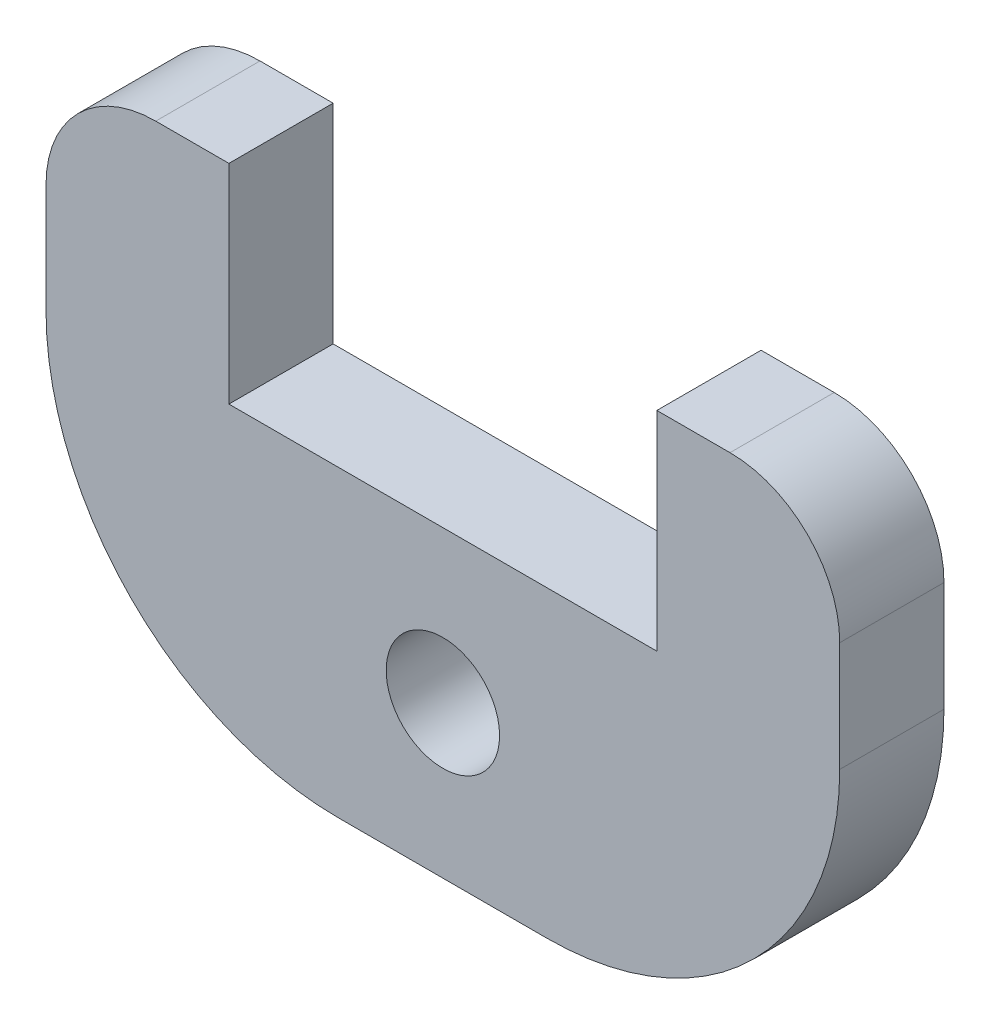
ISO-10303-21;
HEADER;
FILE_DESCRIPTION(('STEP AP214'),'2;1');
FILE_NAME('part.step','',(''),(''),'','','');
FILE_SCHEMA(('AUTOMOTIVE_DESIGN { 1 0 10303 214 1 1 1 1 }'));
ENDSEC;
DATA;
#1=APPLICATION_CONTEXT('core data for automotive mechanical design processes');
#2=APPLICATION_PROTOCOL_DEFINITION('international standard','automotive_design',2000,#1);
#3=PRODUCT_CONTEXT('',#1,'mechanical');
#4=PRODUCT('Part','Part','',(#3));
#5=PRODUCT_RELATED_PRODUCT_CATEGORY('part','',(#4));
#6=PRODUCT_DEFINITION_FORMATION('','',#4);
#7=PRODUCT_DEFINITION_CONTEXT('part definition',#1,'design');
#8=PRODUCT_DEFINITION('design','',#6,#7);
#9=PRODUCT_DEFINITION_SHAPE('','',#8);
#10=(LENGTH_UNIT() NAMED_UNIT(*) SI_UNIT(.MILLI.,.METRE.));
#11=(NAMED_UNIT(*) PLANE_ANGLE_UNIT() SI_UNIT($,.RADIAN.));
#12=(NAMED_UNIT(*) SI_UNIT($,.STERADIAN.) SOLID_ANGLE_UNIT());
#13=UNCERTAINTY_MEASURE_WITH_UNIT(LENGTH_MEASURE(1.E-05),#10,'distance_accuracy_value','');
#14=(GEOMETRIC_REPRESENTATION_CONTEXT(3) GLOBAL_UNCERTAINTY_ASSIGNED_CONTEXT((#13)) GLOBAL_UNIT_ASSIGNED_CONTEXT((#10,
#11,#12)) REPRESENTATION_CONTEXT('',''));
#15=CARTESIAN_POINT('',(0.,0.,0.));
#16=DIRECTION('',(0.,0.,1.));
#17=DIRECTION('',(1.,0.,0.));
#18=AXIS2_PLACEMENT_3D('',#15,#16,#17);
#19=CARTESIAN_POINT('',(10.85,7.,2.85));
#20=DIRECTION('',(-1.,0.,0.));
#21=DIRECTION('',(0.,-1.,0.));
#22=AXIS2_PLACEMENT_3D('',#19,#20,#21);
#23=PLANE('',#22);
#24=DIRECTION('',(0.,1.,0.));
#25=VECTOR('',#24,1.);
#26=CARTESIAN_POINT('',(10.85,7.,0.));
#27=LINE('',#26,#25);
#28=CARTESIAN_POINT('',(10.85,1.,0.));
#29=VERTEX_POINT('',#28);
#30=CARTESIAN_POINT('',(10.85,4.,0.));
#31=VERTEX_POINT('',#30);
#32=EDGE_CURVE('E162',#29,#31,#27,.T.);
#33=ORIENTED_EDGE('',*,*,#32,.T.);
#34=DIRECTION('',(0.,0.,-1.));
#35=VECTOR('',#34,1.);
#36=CARTESIAN_POINT('',(10.85,4.,2.85));
#37=LINE('',#36,#35);
#38=CARTESIAN_POINT('',(10.85,4.,2.85));
#39=VERTEX_POINT('',#38);
#40=EDGE_CURVE('E211',#31,#39,#37,.F.);
#41=ORIENTED_EDGE('',*,*,#40,.T.);
#42=DIRECTION('',(0.,1.,0.));
#43=VECTOR('',#42,1.);
#44=CARTESIAN_POINT('',(10.85,7.,2.85));
#45=LINE('',#44,#43);
#46=CARTESIAN_POINT('',(10.85,1.,2.85));
#47=VERTEX_POINT('',#46);
#48=EDGE_CURVE('E132',#47,#39,#45,.T.);
#49=ORIENTED_EDGE('',*,*,#48,.F.);
#50=DIRECTION('',(0.,0.,-1.));
#51=VECTOR('',#50,1.);
#52=CARTESIAN_POINT('',(10.85,1.,2.85));
#53=LINE('',#52,#51);
#54=EDGE_CURVE('E202',#47,#29,#53,.T.);
#55=ORIENTED_EDGE('',*,*,#54,.T.);
#56=EDGE_LOOP('',(#33,#41,#49,#55));
#57=FACE_BOUND('',#56,.T.);
#58=ADVANCED_FACE('F33',(#57),#23,.F.);
#59=CARTESIAN_POINT('',(5.84999999999999,7.,2.85));
#60=DIRECTION('',(0.,-1.,0.));
#61=DIRECTION('',(0.,0.,-1.));
#62=AXIS2_PLACEMENT_3D('',#59,#60,#61);
#63=PLANE('',#62);
#64=DIRECTION('',(-1.,0.,0.));
#65=VECTOR('',#64,1.);
#66=CARTESIAN_POINT('',(5.84999999999999,7.,2.85));
#67=LINE('',#66,#65);
#68=CARTESIAN_POINT('',(7.84999999999999,7.,2.85));
#69=VERTEX_POINT('',#68);
#70=CARTESIAN_POINT('',(5.84999999999999,7.,2.85));
#71=VERTEX_POINT('',#70);
#72=EDGE_CURVE('E120',#69,#71,#67,.T.);
#73=ORIENTED_EDGE('',*,*,#72,.F.);
#74=DIRECTION('',(0.,0.,-1.));
#75=VECTOR('',#74,1.);
#76=CARTESIAN_POINT('',(7.84999999999999,7.,2.85));
#77=LINE('',#76,#75);
#78=CARTESIAN_POINT('',(7.84999999999999,7.,0.));
#79=VERTEX_POINT('',#78);
#80=EDGE_CURVE('E205',#69,#79,#77,.T.);
#81=ORIENTED_EDGE('',*,*,#80,.T.);
#82=DIRECTION('',(-1.,0.,0.));
#83=VECTOR('',#82,1.);
#84=CARTESIAN_POINT('',(5.84999999999999,7.,0.));
#85=LINE('',#84,#83);
#86=CARTESIAN_POINT('',(5.84999999999999,7.,0.));
#87=VERTEX_POINT('',#86);
#88=EDGE_CURVE('E138',#79,#87,#85,.T.);
#89=ORIENTED_EDGE('',*,*,#88,.T.);
#90=DIRECTION('',(0.,0.,-1.));
#91=VECTOR('',#90,1.);
#92=CARTESIAN_POINT('',(5.84999999999999,7.,2.85));
#93=LINE('',#92,#91);
#94=EDGE_CURVE('E135',#71,#87,#93,.T.);
#95=ORIENTED_EDGE('',*,*,#94,.F.);
#96=EDGE_LOOP('',(#73,#81,#89,#95));
#97=FACE_BOUND('',#96,.T.);
#98=ADVANCED_FACE('F136',(#97),#63,.F.);
#99=CARTESIAN_POINT('',(5.84999999999999,7.,2.85));
#100=DIRECTION('',(1.,0.,0.));
#101=DIRECTION('',(0.,1.,0.));
#102=AXIS2_PLACEMENT_3D('',#99,#100,#101);
#103=PLANE('',#102);
#104=DIRECTION('',(0.,-1.,0.));
#105=VECTOR('',#104,1.);
#106=CARTESIAN_POINT('',(5.84999999999999,7.,0.));
#107=LINE('',#106,#105);
#108=CARTESIAN_POINT('',(5.84999999999999,1.3,0.));
#109=VERTEX_POINT('',#108);
#110=EDGE_CURVE('E167',#87,#109,#107,.T.);
#111=ORIENTED_EDGE('',*,*,#110,.T.);
#112=DIRECTION('',(0.,0.,-1.));
#113=VECTOR('',#112,1.);
#114=CARTESIAN_POINT('',(5.84999999999999,1.3,2.85));
#115=LINE('',#114,#113);
#116=CARTESIAN_POINT('',(5.84999999999999,1.3,2.85));
#117=VERTEX_POINT('',#116);
#118=EDGE_CURVE('E142',#117,#109,#115,.T.);
#119=ORIENTED_EDGE('',*,*,#118,.F.);
#120=DIRECTION('',(0.,-1.,0.));
#121=VECTOR('',#120,1.);
#122=CARTESIAN_POINT('',(5.84999999999999,7.,2.85));
#123=LINE('',#122,#121);
#124=EDGE_CURVE('E125',#71,#117,#123,.T.);
#125=ORIENTED_EDGE('',*,*,#124,.F.);
#126=ORIENTED_EDGE('',*,*,#94,.T.);
#127=EDGE_LOOP('',(#111,#119,#125,#126));
#128=FACE_BOUND('',#127,.T.);
#129=ADVANCED_FACE('F144',(#128),#103,.F.);
#130=CARTESIAN_POINT('',(-5.85,1.3,2.85));
#131=DIRECTION('',(0.,-1.,0.));
#132=DIRECTION('',(0.,0.,-1.));
#133=AXIS2_PLACEMENT_3D('',#130,#131,#132);
#134=PLANE('',#133);
#135=DIRECTION('',(-1.,0.,0.));
#136=VECTOR('',#135,1.);
#137=CARTESIAN_POINT('',(-5.85,1.3,0.));
#138=LINE('',#137,#136);
#139=CARTESIAN_POINT('',(-5.85,1.3,0.));
#140=VERTEX_POINT('',#139);
#141=EDGE_CURVE('E169',#109,#140,#138,.T.);
#142=ORIENTED_EDGE('',*,*,#141,.T.);
#143=DIRECTION('',(0.,0.,-1.));
#144=VECTOR('',#143,1.);
#145=CARTESIAN_POINT('',(-5.85,1.3,2.85));
#146=LINE('',#145,#144);
#147=CARTESIAN_POINT('',(-5.85,1.3,2.85));
#148=VERTEX_POINT('',#147);
#149=EDGE_CURVE('E182',#148,#140,#146,.T.);
#150=ORIENTED_EDGE('',*,*,#149,.F.);
#151=DIRECTION('',(-1.,0.,0.));
#152=VECTOR('',#151,1.);
#153=CARTESIAN_POINT('',(-5.85,1.3,2.85));
#154=LINE('',#153,#152);
#155=EDGE_CURVE('E147',#117,#148,#154,.T.);
#156=ORIENTED_EDGE('',*,*,#155,.F.);
#157=ORIENTED_EDGE('',*,*,#118,.T.);
#158=EDGE_LOOP('',(#142,#150,#156,#157));
#159=FACE_BOUND('',#158,.T.);
#160=ADVANCED_FACE('F283',(#159),#134,.F.);
#161=CARTESIAN_POINT('',(-5.85,7.,2.85));
#162=DIRECTION('',(-1.,0.,0.));
#163=DIRECTION('',(0.,-1.,0.));
#164=AXIS2_PLACEMENT_3D('',#161,#162,#163);
#165=PLANE('',#164);
#166=DIRECTION('',(0.,1.,0.));
#167=VECTOR('',#166,1.);
#168=CARTESIAN_POINT('',(-5.85,7.,0.));
#169=LINE('',#168,#167);
#170=CARTESIAN_POINT('',(-5.85,7.,0.));
#171=VERTEX_POINT('',#170);
#172=EDGE_CURVE('E171',#140,#171,#169,.T.);
#173=ORIENTED_EDGE('',*,*,#172,.T.);
#174=DIRECTION('',(0.,0.,-1.));
#175=VECTOR('',#174,1.);
#176=CARTESIAN_POINT('',(-5.85,7.,2.85));
#177=LINE('',#176,#175);
#178=CARTESIAN_POINT('',(-5.85,7.,2.85));
#179=VERTEX_POINT('',#178);
#180=EDGE_CURVE('E161',#179,#171,#177,.T.);
#181=ORIENTED_EDGE('',*,*,#180,.F.);
#182=DIRECTION('',(0.,1.,0.));
#183=VECTOR('',#182,1.);
#184=CARTESIAN_POINT('',(-5.85,7.,2.85));
#185=LINE('',#184,#183);
#186=EDGE_CURVE('E149',#148,#179,#185,.T.);
#187=ORIENTED_EDGE('',*,*,#186,.F.);
#188=ORIENTED_EDGE('',*,*,#149,.T.);
#189=EDGE_LOOP('',(#173,#181,#187,#188));
#190=FACE_BOUND('',#189,.T.);
#191=ADVANCED_FACE('F288',(#190),#165,.F.);
#192=CARTESIAN_POINT('',(-10.85,7.,2.85));
#193=DIRECTION('',(0.,-1.,0.));
#194=DIRECTION('',(0.,0.,-1.));
#195=AXIS2_PLACEMENT_3D('',#192,#193,#194);
#196=PLANE('',#195);
#197=DIRECTION('',(-1.,0.,0.));
#198=VECTOR('',#197,1.);
#199=CARTESIAN_POINT('',(-10.85,7.,0.));
#200=LINE('',#199,#198);
#201=CARTESIAN_POINT('',(-7.85000000000001,7.,0.));
#202=VERTEX_POINT('',#201);
#203=EDGE_CURVE('E173',#171,#202,#200,.T.);
#204=ORIENTED_EDGE('',*,*,#203,.T.);
#205=DIRECTION('',(0.,0.,-1.));
#206=VECTOR('',#205,1.);
#207=CARTESIAN_POINT('',(-7.85000000000001,7.,2.85));
#208=LINE('',#207,#206);
#209=CARTESIAN_POINT('',(-7.85000000000001,7.,2.85));
#210=VERTEX_POINT('',#209);
#211=EDGE_CURVE('E11',#202,#210,#208,.F.);
#212=ORIENTED_EDGE('',*,*,#211,.T.);
#213=DIRECTION('',(-1.,0.,0.));
#214=VECTOR('',#213,1.);
#215=CARTESIAN_POINT('',(-10.85,7.,2.85));
#216=LINE('',#215,#214);
#217=EDGE_CURVE('E154',#179,#210,#216,.T.);
#218=ORIENTED_EDGE('',*,*,#217,.F.);
#219=ORIENTED_EDGE('',*,*,#180,.T.);
#220=EDGE_LOOP('',(#204,#212,#218,#219));
#221=FACE_BOUND('',#220,.T.);
#222=ADVANCED_FACE('F289',(#221),#196,.F.);
#223=CARTESIAN_POINT('',(-10.85,7.,2.85));
#224=DIRECTION('',(1.,0.,0.));
#225=DIRECTION('',(0.,1.,0.));
#226=AXIS2_PLACEMENT_3D('',#223,#224,#225);
#227=PLANE('',#226);
#228=DIRECTION('',(0.,-1.,0.));
#229=VECTOR('',#228,1.);
#230=CARTESIAN_POINT('',(-10.85,7.,2.85));
#231=LINE('',#230,#229);
#232=CARTESIAN_POINT('',(-10.85,4.,2.85));
#233=VERTEX_POINT('',#232);
#234=CARTESIAN_POINT('',(-10.85,0.999999999999998,2.85));
#235=VERTEX_POINT('',#234);
#236=EDGE_CURVE('E156',#233,#235,#231,.T.);
#237=ORIENTED_EDGE('',*,*,#236,.F.);
#238=DIRECTION('',(0.,0.,-1.));
#239=VECTOR('',#238,1.);
#240=CARTESIAN_POINT('',(-10.85,4.,2.85));
#241=LINE('',#240,#239);
#242=CARTESIAN_POINT('',(-10.85,4.,0.));
#243=VERTEX_POINT('',#242);
#244=EDGE_CURVE('E41',#233,#243,#241,.T.);
#245=ORIENTED_EDGE('',*,*,#244,.T.);
#246=DIRECTION('',(0.,-1.,0.));
#247=VECTOR('',#246,1.);
#248=CARTESIAN_POINT('',(-10.85,7.,0.));
#249=LINE('',#248,#247);
#250=CARTESIAN_POINT('',(-10.85,0.999999999999998,0.));
#251=VERTEX_POINT('',#250);
#252=EDGE_CURVE('E175',#243,#251,#249,.T.);
#253=ORIENTED_EDGE('',*,*,#252,.T.);
#254=DIRECTION('',(0.,0.,-1.));
#255=VECTOR('',#254,1.);
#256=CARTESIAN_POINT('',(-10.85,0.999999999999998,2.85));
#257=LINE('',#256,#255);
#258=EDGE_CURVE('E195',#251,#235,#257,.F.);
#259=ORIENTED_EDGE('',*,*,#258,.T.);
#260=EDGE_LOOP('',(#237,#245,#253,#259));
#261=FACE_BOUND('',#260,.T.);
#262=ADVANCED_FACE('F218',(#261),#227,.F.);
#263=CARTESIAN_POINT('',(-10.85,-7.,2.85));
#264=DIRECTION('',(0.,1.,0.));
#265=DIRECTION('',(0.,0.,1.));
#266=AXIS2_PLACEMENT_3D('',#263,#264,#265);
#267=PLANE('',#266);
#268=DIRECTION('',(1.,0.,0.));
#269=VECTOR('',#268,1.);
#270=CARTESIAN_POINT('',(-10.85,-7.,2.85));
#271=LINE('',#270,#269);
#272=CARTESIAN_POINT('',(-2.85000000000001,-7.,2.85));
#273=VERTEX_POINT('',#272);
#274=CARTESIAN_POINT('',(2.84999999999999,-7.,2.85));
#275=VERTEX_POINT('',#274);
#276=EDGE_CURVE('E158',#273,#275,#271,.T.);
#277=ORIENTED_EDGE('',*,*,#276,.F.);
#278=DIRECTION('',(0.,0.,-1.));
#279=VECTOR('',#278,1.);
#280=CARTESIAN_POINT('',(-2.85000000000001,-7.,2.85));
#281=LINE('',#280,#279);
#282=CARTESIAN_POINT('',(-2.85000000000001,-7.,0.));
#283=VERTEX_POINT('',#282);
#284=EDGE_CURVE('E187',#273,#283,#281,.T.);
#285=ORIENTED_EDGE('',*,*,#284,.T.);
#286=DIRECTION('',(1.,0.,0.));
#287=VECTOR('',#286,1.);
#288=CARTESIAN_POINT('',(-10.85,-7.,0.));
#289=LINE('',#288,#287);
#290=CARTESIAN_POINT('',(2.84999999999999,-7.,0.));
#291=VERTEX_POINT('',#290);
#292=EDGE_CURVE('E177',#283,#291,#289,.T.);
#293=ORIENTED_EDGE('',*,*,#292,.T.);
#294=DIRECTION('',(0.,0.,-1.));
#295=VECTOR('',#294,1.);
#296=CARTESIAN_POINT('',(2.84999999999999,-7.,2.85));
#297=LINE('',#296,#295);
#298=EDGE_CURVE('E141',#291,#275,#297,.F.);
#299=ORIENTED_EDGE('',*,*,#298,.T.);
#300=EDGE_LOOP('',(#277,#285,#293,#299));
#301=FACE_BOUND('',#300,.T.);
#302=ADVANCED_FACE('F232',(#301),#267,.F.);
#303=CARTESIAN_POINT('',(0.,0.,2.85));
#304=DIRECTION('',(0.,0.,1.));
#305=DIRECTION('',(1.,0.,0.));
#306=AXIS2_PLACEMENT_3D('',#303,#304,#305);
#307=PLANE('',#306);
#308=CARTESIAN_POINT('',(0.,-2.85,2.85));
#309=DIRECTION('',(0.,0.,1.));
#310=DIRECTION('',(1.,0.,0.));
#311=AXIS2_PLACEMENT_3D('',#308,#309,#310);
#312=CIRCLE('',#311,1.55);
#313=CARTESIAN_POINT('',(1.55,-2.85,2.85));
#314=VERTEX_POINT('',#313);
#315=EDGE_CURVE('E242',#314,#314,#312,.T.);
#316=ORIENTED_EDGE('',*,*,#315,.F.);
#317=EDGE_LOOP('',(#316));
#318=FACE_BOUND('',#317,.T.);
#319=ORIENTED_EDGE('',*,*,#48,.T.);
#320=CARTESIAN_POINT('',(7.84999999999999,4.,2.85));
#321=DIRECTION('',(0.,0.,1.));
#322=DIRECTION('',(1.,0.,0.));
#323=AXIS2_PLACEMENT_3D('',#320,#321,#322);
#324=CIRCLE('',#323,3.);
#325=EDGE_CURVE('E128',#39,#69,#324,.T.);
#326=ORIENTED_EDGE('',*,*,#325,.T.);
#327=ORIENTED_EDGE('',*,*,#72,.T.);
#328=ORIENTED_EDGE('',*,*,#124,.T.);
#329=ORIENTED_EDGE('',*,*,#155,.T.);
#330=ORIENTED_EDGE('',*,*,#186,.T.);
#331=ORIENTED_EDGE('',*,*,#217,.T.);
#332=CARTESIAN_POINT('',(-7.85000000000001,4.,2.85));
#333=DIRECTION('',(0.,0.,1.));
#334=DIRECTION('',(1.,0.,0.));
#335=AXIS2_PLACEMENT_3D('',#332,#333,#334);
#336=CIRCLE('',#335,3.);
#337=EDGE_CURVE('E53',#210,#233,#336,.T.);
#338=ORIENTED_EDGE('',*,*,#337,.T.);
#339=ORIENTED_EDGE('',*,*,#236,.T.);
#340=CARTESIAN_POINT('',(-2.85000000000001,0.999999999999999,2.85));
#341=DIRECTION('',(0.,0.,1.));
#342=DIRECTION('',(1.,0.,0.));
#343=AXIS2_PLACEMENT_3D('',#340,#341,#342);
#344=CIRCLE('',#343,8.);
#345=EDGE_CURVE('E200',#235,#273,#344,.T.);
#346=ORIENTED_EDGE('',*,*,#345,.T.);
#347=ORIENTED_EDGE('',*,*,#276,.T.);
#348=CARTESIAN_POINT('',(2.84999999999999,0.999999999999999,2.85));
#349=DIRECTION('',(0.,0.,1.));
#350=DIRECTION('',(1.,0.,0.));
#351=AXIS2_PLACEMENT_3D('',#348,#349,#350);
#352=CIRCLE('',#351,8.);
#353=EDGE_CURVE('E198',#275,#47,#352,.T.);
#354=ORIENTED_EDGE('',*,*,#353,.T.);
#355=EDGE_LOOP('',(#319,#326,#327,#328,#329,#330,#331,#338,#339,#346,#347,#354));
#356=FACE_BOUND('',#355,.T.);
#357=ADVANCED_FACE('F123',(#318,#356),#307,.T.);
#358=CARTESIAN_POINT('',(0.,0.,0.));
#359=DIRECTION('',(0.,0.,1.));
#360=DIRECTION('',(1.,0.,0.));
#361=AXIS2_PLACEMENT_3D('',#358,#359,#360);
#362=PLANE('',#361);
#363=CARTESIAN_POINT('',(0.,-2.85,0.));
#364=DIRECTION('',(0.,0.,1.));
#365=DIRECTION('',(1.,0.,0.));
#366=AXIS2_PLACEMENT_3D('',#363,#364,#365);
#367=CIRCLE('',#366,1.55);
#368=CARTESIAN_POINT('',(1.55,-2.85,0.));
#369=VERTEX_POINT('',#368);
#370=EDGE_CURVE('E165',#369,#369,#367,.T.);
#371=ORIENTED_EDGE('',*,*,#370,.T.);
#372=EDGE_LOOP('',(#371));
#373=FACE_BOUND('',#372,.T.);
#374=ORIENTED_EDGE('',*,*,#88,.F.);
#375=CARTESIAN_POINT('',(7.84999999999999,4.,0.));
#376=DIRECTION('',(0.,0.,1.));
#377=DIRECTION('',(1.,0.,0.));
#378=AXIS2_PLACEMENT_3D('',#375,#376,#377);
#379=CIRCLE('',#378,3.);
#380=EDGE_CURVE('E209',#79,#31,#379,.F.);
#381=ORIENTED_EDGE('',*,*,#380,.T.);
#382=ORIENTED_EDGE('',*,*,#32,.F.);
#383=CARTESIAN_POINT('',(2.84999999999999,0.999999999999999,0.));
#384=DIRECTION('',(0.,0.,1.));
#385=DIRECTION('',(1.,0.,0.));
#386=AXIS2_PLACEMENT_3D('',#383,#384,#385);
#387=CIRCLE('',#386,8.);
#388=EDGE_CURVE('E190',#29,#291,#387,.F.);
#389=ORIENTED_EDGE('',*,*,#388,.T.);
#390=ORIENTED_EDGE('',*,*,#292,.F.);
#391=CARTESIAN_POINT('',(-2.85000000000001,0.999999999999999,0.));
#392=DIRECTION('',(0.,0.,1.));
#393=DIRECTION('',(1.,0.,0.));
#394=AXIS2_PLACEMENT_3D('',#391,#392,#393);
#395=CIRCLE('',#394,8.);
#396=EDGE_CURVE('E192',#283,#251,#395,.F.);
#397=ORIENTED_EDGE('',*,*,#396,.T.);
#398=ORIENTED_EDGE('',*,*,#252,.F.);
#399=CARTESIAN_POINT('',(-7.85000000000001,4.,0.));
#400=DIRECTION('',(0.,0.,1.));
#401=DIRECTION('',(1.,0.,0.));
#402=AXIS2_PLACEMENT_3D('',#399,#400,#401);
#403=CIRCLE('',#402,3.);
#404=EDGE_CURVE('E207',#243,#202,#403,.F.);
#405=ORIENTED_EDGE('',*,*,#404,.T.);
#406=ORIENTED_EDGE('',*,*,#203,.F.);
#407=ORIENTED_EDGE('',*,*,#172,.F.);
#408=ORIENTED_EDGE('',*,*,#141,.F.);
#409=ORIENTED_EDGE('',*,*,#110,.F.);
#410=EDGE_LOOP('',(#374,#381,#382,#389,#390,#397,#398,#405,#406,#407,#408,#409));
#411=FACE_BOUND('',#410,.T.);
#412=ADVANCED_FACE('F221',(#373,#411),#362,.F.);
#413=CARTESIAN_POINT('',(0.,-2.85,0.));
#414=DIRECTION('',(0.,0.,1.));
#415=DIRECTION('',(1.,0.,0.));
#416=AXIS2_PLACEMENT_3D('',#413,#414,#415);
#417=CYLINDRICAL_SURFACE('',#416,1.55);
#418=ORIENTED_EDGE('',*,*,#370,.F.);
#419=EDGE_LOOP('',(#418));
#420=FACE_BOUND('',#419,.T.);
#421=ORIENTED_EDGE('',*,*,#315,.T.);
#422=EDGE_LOOP('',(#421));
#423=FACE_BOUND('',#422,.T.);
#424=ADVANCED_FACE('F249',(#420,#423),#417,.F.);
#425=CARTESIAN_POINT('',(-2.85000000000001,0.999999999999999,2.85));
#426=DIRECTION('',(0.,0.,-1.));
#427=DIRECTION('',(-1.,0.,0.));
#428=AXIS2_PLACEMENT_3D('',#425,#426,#427);
#429=CYLINDRICAL_SURFACE('',#428,8.);
#430=ORIENTED_EDGE('',*,*,#345,.F.);
#431=ORIENTED_EDGE('',*,*,#258,.F.);
#432=ORIENTED_EDGE('',*,*,#396,.F.);
#433=ORIENTED_EDGE('',*,*,#284,.F.);
#434=EDGE_LOOP('',(#430,#431,#432,#433));
#435=FACE_BOUND('',#434,.T.);
#436=ADVANCED_FACE('F228',(#435),#429,.T.);
#437=CARTESIAN_POINT('',(2.84999999999999,0.999999999999999,2.85));
#438=DIRECTION('',(0.,0.,-1.));
#439=DIRECTION('',(-1.,0.,0.));
#440=AXIS2_PLACEMENT_3D('',#437,#438,#439);
#441=CYLINDRICAL_SURFACE('',#440,8.);
#442=ORIENTED_EDGE('',*,*,#353,.F.);
#443=ORIENTED_EDGE('',*,*,#298,.F.);
#444=ORIENTED_EDGE('',*,*,#388,.F.);
#445=ORIENTED_EDGE('',*,*,#54,.F.);
#446=EDGE_LOOP('',(#442,#443,#444,#445));
#447=FACE_BOUND('',#446,.T.);
#448=ADVANCED_FACE('F235',(#447),#441,.T.);
#449=CARTESIAN_POINT('',(7.84999999999999,4.,2.85));
#450=DIRECTION('',(0.,0.,-1.));
#451=DIRECTION('',(-1.,0.,0.));
#452=AXIS2_PLACEMENT_3D('',#449,#450,#451);
#453=CYLINDRICAL_SURFACE('',#452,3.);
#454=ORIENTED_EDGE('',*,*,#325,.F.);
#455=ORIENTED_EDGE('',*,*,#40,.F.);
#456=ORIENTED_EDGE('',*,*,#380,.F.);
#457=ORIENTED_EDGE('',*,*,#80,.F.);
#458=EDGE_LOOP('',(#454,#455,#456,#457));
#459=FACE_BOUND('',#458,.T.);
#460=ADVANCED_FACE('F274',(#459),#453,.T.);
#461=CARTESIAN_POINT('',(-7.85000000000001,4.,2.85));
#462=DIRECTION('',(0.,0.,-1.));
#463=DIRECTION('',(-1.,0.,0.));
#464=AXIS2_PLACEMENT_3D('',#461,#462,#463);
#465=CYLINDRICAL_SURFACE('',#464,3.);
#466=ORIENTED_EDGE('',*,*,#337,.F.);
#467=ORIENTED_EDGE('',*,*,#211,.F.);
#468=ORIENTED_EDGE('',*,*,#404,.F.);
#469=ORIENTED_EDGE('',*,*,#244,.F.);
#470=EDGE_LOOP('',(#466,#467,#468,#469));
#471=FACE_BOUND('',#470,.T.);
#472=ADVANCED_FACE('F35',(#471),#465,.T.);
#473=CLOSED_SHELL('',(#58,#98,#129,#160,#191,#222,#262,#302,#357,#412,#424,#436,#448,#460,#472));
#474=MANIFOLD_SOLID_BREP('B2',#473);
#475=ADVANCED_BREP_SHAPE_REPRESENTATION('',(#18,#474),#14);
#476=SHAPE_DEFINITION_REPRESENTATION(#9,#475);
ENDSEC;
END-ISO-10303-21;
